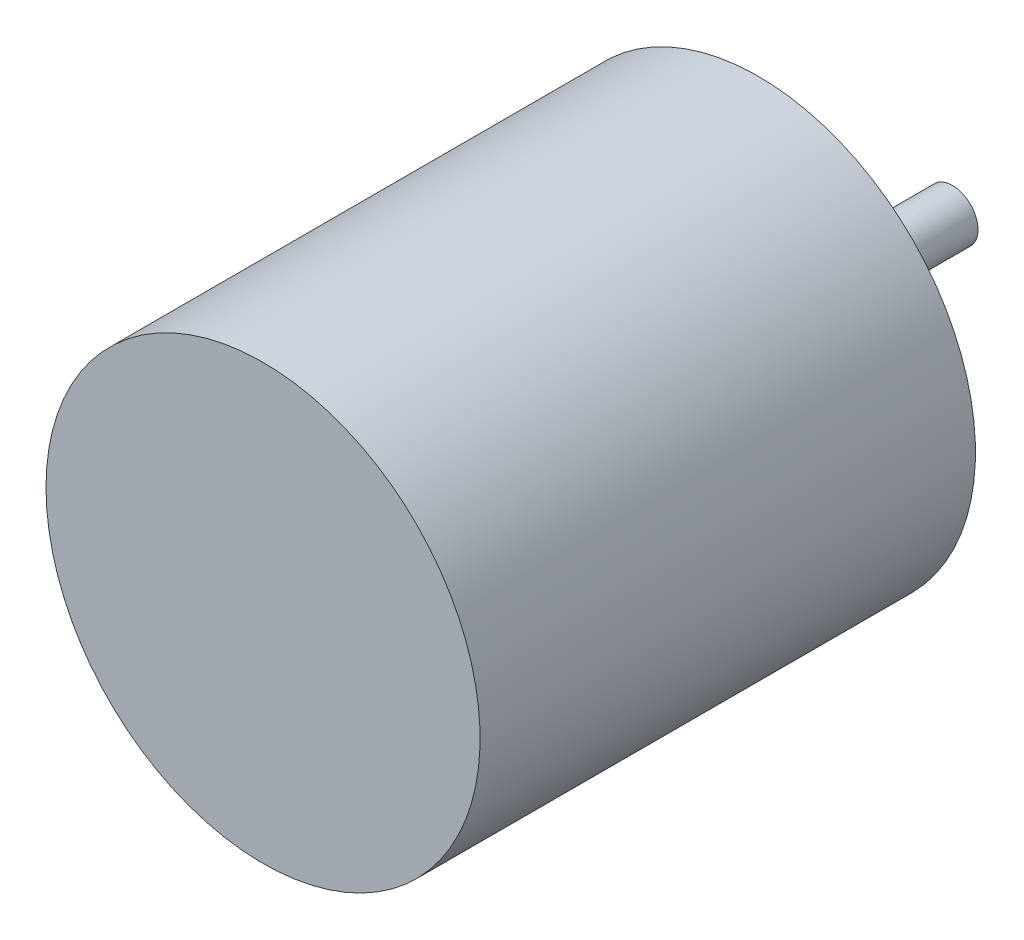
ISO-10303-21;
HEADER;
FILE_DESCRIPTION(('STEP AP214'),'2;1');
FILE_NAME('part.step','',(''),(''),'','','');
FILE_SCHEMA(('AUTOMOTIVE_DESIGN { 1 0 10303 214 1 1 1 1 }'));
ENDSEC;
DATA;
#1=APPLICATION_CONTEXT('core data for automotive mechanical design processes');
#2=APPLICATION_PROTOCOL_DEFINITION('international standard','automotive_design',2000,#1);
#3=PRODUCT_CONTEXT('',#1,'mechanical');
#4=PRODUCT('Part','Part','',(#3));
#5=PRODUCT_RELATED_PRODUCT_CATEGORY('part','',(#4));
#6=PRODUCT_DEFINITION_FORMATION('','',#4);
#7=PRODUCT_DEFINITION_CONTEXT('part definition',#1,'design');
#8=PRODUCT_DEFINITION('design','',#6,#7);
#9=PRODUCT_DEFINITION_SHAPE('','',#8);
#10=(LENGTH_UNIT() NAMED_UNIT(*) SI_UNIT(.MILLI.,.METRE.));
#11=(NAMED_UNIT(*) PLANE_ANGLE_UNIT() SI_UNIT($,.RADIAN.));
#12=(NAMED_UNIT(*) SI_UNIT($,.STERADIAN.) SOLID_ANGLE_UNIT());
#13=UNCERTAINTY_MEASURE_WITH_UNIT(LENGTH_MEASURE(1.E-05),#10,'distance_accuracy_value','');
#14=(GEOMETRIC_REPRESENTATION_CONTEXT(3) GLOBAL_UNCERTAINTY_ASSIGNED_CONTEXT((#13)) GLOBAL_UNIT_ASSIGNED_CONTEXT((#10,
#11,#12)) REPRESENTATION_CONTEXT('',''));
#15=CARTESIAN_POINT('',(0.,0.,0.));
#16=DIRECTION('',(0.,0.,1.));
#17=DIRECTION('',(1.,0.,0.));
#18=AXIS2_PLACEMENT_3D('',#15,#16,#17);
#19=CARTESIAN_POINT('',(0.,0.,24.25));
#20=DIRECTION('',(0.,0.,-1.));
#21=DIRECTION('',(-1.,0.,0.));
#22=AXIS2_PLACEMENT_3D('',#19,#20,#21);
#23=CYLINDRICAL_SURFACE('',#22,21.25);
#24=CARTESIAN_POINT('',(0.,0.,24.25));
#25=DIRECTION('',(0.,0.,1.));
#26=DIRECTION('',(1.,0.,0.));
#27=AXIS2_PLACEMENT_3D('',#24,#25,#26);
#28=CIRCLE('',#27,21.25);
#29=CARTESIAN_POINT('',(-21.25,0.,24.25));
#30=VERTEX_POINT('',#29);
#31=EDGE_CURVE('E52',#30,#30,#28,.T.);
#32=CARTESIAN_POINT('',(0.,0.,-24.25));
#33=DIRECTION('',(0.,0.,1.));
#34=DIRECTION('',(1.,0.,0.));
#35=AXIS2_PLACEMENT_3D('',#32,#33,#34);
#36=CIRCLE('',#35,21.25);
#37=CARTESIAN_POINT('',(-21.25,0.,-24.25));
#38=VERTEX_POINT('',#37);
#39=EDGE_CURVE('E60',#38,#38,#36,.T.);
#40=CARTESIAN_POINT('',(-21.25,0.,24.25));
#41=CARTESIAN_POINT('',(-21.25,0.,23.7447916666667));
#42=CARTESIAN_POINT('',(-21.25,0.,23.2395833333333));
#43=CARTESIAN_POINT('',(-21.25,0.,22.2291666666667));
#44=CARTESIAN_POINT('',(-21.25,0.,21.7239583333333));
#45=CARTESIAN_POINT('',(-21.25,0.,20.7135416666667));
#46=CARTESIAN_POINT('',(-21.25,0.,20.2083333333333));
#47=CARTESIAN_POINT('',(-21.25,0.,19.1979166666667));
#48=CARTESIAN_POINT('',(-21.25,0.,18.6927083333333));
#49=CARTESIAN_POINT('',(-21.25,0.,17.6822916666667));
#50=CARTESIAN_POINT('',(-21.25,0.,17.1770833333333));
#51=CARTESIAN_POINT('',(-21.25,0.,16.1666666666667));
#52=CARTESIAN_POINT('',(-21.25,0.,15.6614583333333));
#53=CARTESIAN_POINT('',(-21.25,0.,14.6510416666667));
#54=CARTESIAN_POINT('',(-21.25,0.,14.1458333333333));
#55=CARTESIAN_POINT('',(-21.25,0.,13.1354166666667));
#56=CARTESIAN_POINT('',(-21.25,0.,12.6302083333333));
#57=CARTESIAN_POINT('',(-21.25,0.,11.6197916666667));
#58=CARTESIAN_POINT('',(-21.25,0.,11.1145833333333));
#59=CARTESIAN_POINT('',(-21.25,0.,10.1041666666667));
#60=CARTESIAN_POINT('',(-21.25,0.,9.59895833333333));
#61=CARTESIAN_POINT('',(-21.25,0.,8.58854166666666));
#62=CARTESIAN_POINT('',(-21.25,0.,8.08333333333333));
#63=CARTESIAN_POINT('',(-21.25,0.,7.07291666666667));
#64=CARTESIAN_POINT('',(-21.25,0.,6.56770833333333));
#65=CARTESIAN_POINT('',(-21.25,0.,5.55729166666667));
#66=CARTESIAN_POINT('',(-21.25,0.,5.05208333333333));
#67=CARTESIAN_POINT('',(-21.25,0.,4.04166666666667));
#68=CARTESIAN_POINT('',(-21.25,0.,3.53645833333333));
#69=CARTESIAN_POINT('',(-21.25,0.,2.52604166666666));
#70=CARTESIAN_POINT('',(-21.25,0.,2.02083333333333));
#71=CARTESIAN_POINT('',(-21.25,0.,1.01041666666666));
#72=CARTESIAN_POINT('',(-21.25,0.,0.50520833333333));
#73=CARTESIAN_POINT('',(-21.25,0.,-0.505208333333337));
#74=CARTESIAN_POINT('',(-21.25,0.,-1.01041666666667));
#75=CARTESIAN_POINT('',(-21.25,0.,-2.02083333333334));
#76=CARTESIAN_POINT('',(-21.25,0.,-2.52604166666667));
#77=CARTESIAN_POINT('',(-21.25,0.,-3.53645833333334));
#78=CARTESIAN_POINT('',(-21.25,0.,-4.04166666666667));
#79=CARTESIAN_POINT('',(-21.25,0.,-5.05208333333334));
#80=CARTESIAN_POINT('',(-21.25,0.,-5.55729166666667));
#81=CARTESIAN_POINT('',(-21.25,0.,-6.56770833333334));
#82=CARTESIAN_POINT('',(-21.25,0.,-7.07291666666667));
#83=CARTESIAN_POINT('',(-21.25,0.,-8.08333333333334));
#84=CARTESIAN_POINT('',(-21.25,0.,-8.58854166666667));
#85=CARTESIAN_POINT('',(-21.25,0.,-9.59895833333334));
#86=CARTESIAN_POINT('',(-21.25,0.,-10.1041666666667));
#87=CARTESIAN_POINT('',(-21.25,0.,-11.1145833333333));
#88=CARTESIAN_POINT('',(-21.25,0.,-11.6197916666667));
#89=CARTESIAN_POINT('',(-21.25,0.,-12.6302083333333));
#90=CARTESIAN_POINT('',(-21.25,0.,-13.1354166666667));
#91=CARTESIAN_POINT('',(-21.25,0.,-14.1458333333333));
#92=CARTESIAN_POINT('',(-21.25,0.,-14.6510416666667));
#93=CARTESIAN_POINT('',(-21.25,0.,-15.6614583333333));
#94=CARTESIAN_POINT('',(-21.25,0.,-16.1666666666667));
#95=CARTESIAN_POINT('',(-21.25,0.,-17.1770833333333));
#96=CARTESIAN_POINT('',(-21.25,0.,-17.6822916666667));
#97=CARTESIAN_POINT('',(-21.25,0.,-18.6927083333333));
#98=CARTESIAN_POINT('',(-21.25,0.,-19.1979166666667));
#99=CARTESIAN_POINT('',(-21.25,0.,-20.2083333333333));
#100=CARTESIAN_POINT('',(-21.25,0.,-20.7135416666667));
#101=CARTESIAN_POINT('',(-21.25,0.,-21.7239583333333));
#102=CARTESIAN_POINT('',(-21.25,0.,-22.2291666666667));
#103=CARTESIAN_POINT('',(-21.25,0.,-23.2395833333333));
#104=CARTESIAN_POINT('',(-21.25,0.,-23.7447916666667));
#105=CARTESIAN_POINT('',(-21.25,0.,-24.25));
#106=B_SPLINE_CURVE_WITH_KNOTS('',3,(#40,#41,#42,#43,#44,#45,#46,#47,#48,#49,#50,#51,#52,#53,
#54,#55,#56,#57,#58,#59,#60,#61,#62,#63,#64,#65,#66,#67,#68,#69,#70,#71,#72,#73,#74,#75,#76,#77,
#78,#79,#80,#81,#82,#83,#84,#85,#86,#87,#88,#89,#90,#91,#92,#93,#94,#95,#96,#97,#98,#99,#100,
#101,#102,#103,#104,#105),.UNSPECIFIED.,.F.,.F.,(4,2,2,2,2,2,2,2,2,2,2,2,2,2,2,2,2,2,2,2,2,2,2,
2,2,2,2,2,2,2,2,2,4),(0.,1.515625,3.03125,4.546875,6.0625,7.57812500000001,9.09375,10.609375,
12.125,13.640625,15.15625,16.671875,18.1875,19.703125,21.21875,22.734375,24.25,25.765625,
27.28125,28.796875,30.3125,31.828125,33.34375,34.859375,36.375,37.890625,39.40625,40.921875,
42.4375,43.953125,45.46875,46.984375,48.5),.UNSPECIFIED.);
#107=EDGE_CURVE('BSEAM50',#30,#38,#106,.T.);
#108=ORIENTED_EDGE('',*,*,#31,.F.);
#109=ORIENTED_EDGE('',*,*,#39,.T.);
#110=ORIENTED_EDGE('',*,*,#107,.T.);
#111=ORIENTED_EDGE('',*,*,#107,.F.);
#112=EDGE_LOOP('',(#108,#110,#109,#111));
#113=FACE_BOUND('',#112,.T.);
#114=ADVANCED_FACE('F50',(#113),#23,.T.);
#115=CARTESIAN_POINT('',(0.,0.,24.25));
#116=DIRECTION('',(0.,0.,1.));
#117=DIRECTION('',(1.,0.,0.));
#118=AXIS2_PLACEMENT_3D('',#115,#116,#117);
#119=PLANE('',#118);
#120=ORIENTED_EDGE('',*,*,#31,.T.);
#121=EDGE_LOOP('',(#120));
#122=FACE_BOUND('',#121,.T.);
#123=ADVANCED_FACE('F100',(#122),#119,.T.);
#124=CARTESIAN_POINT('',(0.,0.,-24.25));
#125=DIRECTION('',(0.,0.,1.));
#126=DIRECTION('',(1.,0.,0.));
#127=AXIS2_PLACEMENT_3D('',#124,#125,#126);
#128=PLANE('',#127);
#129=CARTESIAN_POINT('',(9.0017886722874,-8.67281965104073,-24.25));
#130=DIRECTION('',(0.,0.,-1.));
#131=DIRECTION('',(-1.,0.,0.));
#132=AXIS2_PLACEMENT_3D('',#129,#130,#131);
#133=CIRCLE('',#132,1.5);
#134=CARTESIAN_POINT('',(7.5017886722874,-8.67281965104073,-24.25));
#135=VERTEX_POINT('',#134);
#136=EDGE_CURVE('E76',#135,#135,#133,.T.);
#137=ORIENTED_EDGE('',*,*,#136,.F.);
#138=EDGE_LOOP('',(#137));
#139=FACE_BOUND('',#138,.T.);
#140=CARTESIAN_POINT('',(-8.67281965104076,-9.00178867228738,-24.25));
#141=DIRECTION('',(0.,0.,-1.));
#142=DIRECTION('',(-1.,0.,0.));
#143=AXIS2_PLACEMENT_3D('',#140,#141,#142);
#144=CIRCLE('',#143,1.5);
#145=CARTESIAN_POINT('',(-10.1728196510408,-9.00178867228738,-24.25));
#146=VERTEX_POINT('',#145);
#147=EDGE_CURVE('E81',#146,#146,#144,.T.);
#148=ORIENTED_EDGE('',*,*,#147,.F.);
#149=EDGE_LOOP('',(#148));
#150=FACE_BOUND('',#149,.T.);
#151=CARTESIAN_POINT('',(-9.00178867228734,8.67281965104079,-24.25));
#152=DIRECTION('',(0.,0.,-1.));
#153=DIRECTION('',(-1.,0.,0.));
#154=AXIS2_PLACEMENT_3D('',#151,#152,#153);
#155=CIRCLE('',#154,1.5);
#156=CARTESIAN_POINT('',(-10.5017886722873,8.67281965104079,-24.25));
#157=VERTEX_POINT('',#156);
#158=EDGE_CURVE('E67',#157,#157,#155,.T.);
#159=ORIENTED_EDGE('',*,*,#158,.F.);
#160=EDGE_LOOP('',(#159));
#161=FACE_BOUND('',#160,.T.);
#162=CARTESIAN_POINT('',(8.67281965104082,9.00178867228731,-24.25));
#163=DIRECTION('',(0.,0.,-1.));
#164=DIRECTION('',(-1.,0.,0.));
#165=AXIS2_PLACEMENT_3D('',#162,#163,#164);
#166=CIRCLE('',#165,1.5);
#167=CARTESIAN_POINT('',(7.17281965104082,9.00178867228731,-24.25));
#168=VERTEX_POINT('',#167);
#169=EDGE_CURVE('E66',#168,#168,#166,.T.);
#170=ORIENTED_EDGE('',*,*,#169,.F.);
#171=EDGE_LOOP('',(#170));
#172=FACE_BOUND('',#171,.T.);
#173=CARTESIAN_POINT('',(0.,0.,-24.25));
#174=DIRECTION('',(0.,0.,1.));
#175=DIRECTION('',(1.,0.,0.));
#176=AXIS2_PLACEMENT_3D('',#173,#174,#175);
#177=CIRCLE('',#176,2.5);
#178=CARTESIAN_POINT('',(2.5,0.,-24.25));
#179=VERTEX_POINT('',#178);
#180=EDGE_CURVE('E10',#179,#179,#177,.F.);
#181=ORIENTED_EDGE('',*,*,#180,.F.);
#182=EDGE_LOOP('',(#181));
#183=FACE_BOUND('',#182,.T.);
#184=ORIENTED_EDGE('',*,*,#39,.F.);
#185=EDGE_LOOP('',(#184));
#186=FACE_BOUND('',#185,.T.);
#187=ADVANCED_FACE('F91',(#139,#150,#161,#172,#183,#186),#128,.F.);
#188=CARTESIAN_POINT('',(0.,0.,-43.25));
#189=DIRECTION('',(0.,0.,1.));
#190=DIRECTION('',(1.,0.,0.));
#191=AXIS2_PLACEMENT_3D('',#188,#189,#190);
#192=CYLINDRICAL_SURFACE('',#191,2.5);
#193=CARTESIAN_POINT('',(0.,0.,-43.25));
#194=DIRECTION('',(0.,0.,-1.));
#195=DIRECTION('',(-1.,0.,0.));
#196=AXIS2_PLACEMENT_3D('',#193,#194,#195);
#197=CIRCLE('',#196,2.5);
#198=CARTESIAN_POINT('',(-2.5,0.,-43.25));
#199=VERTEX_POINT('',#198);
#200=EDGE_CURVE('E62',#199,#199,#197,.T.);
#201=ORIENTED_EDGE('',*,*,#200,.F.);
#202=EDGE_LOOP('',(#201));
#203=FACE_BOUND('',#202,.T.);
#204=ORIENTED_EDGE('',*,*,#180,.T.);
#205=EDGE_LOOP('',(#204));
#206=FACE_BOUND('',#205,.T.);
#207=ADVANCED_FACE('F96',(#203,#206),#192,.T.);
#208=CARTESIAN_POINT('',(0.,0.,-43.25));
#209=DIRECTION('',(0.,0.,-1.));
#210=DIRECTION('',(-1.,0.,0.));
#211=AXIS2_PLACEMENT_3D('',#208,#209,#210);
#212=PLANE('',#211);
#213=ORIENTED_EDGE('',*,*,#200,.T.);
#214=EDGE_LOOP('',(#213));
#215=FACE_BOUND('',#214,.T.);
#216=ADVANCED_FACE('F113',(#215),#212,.T.);
#217=CARTESIAN_POINT('',(8.67281965104082,9.00178867228731,-22.25));
#218=DIRECTION('',(0.,0.,-1.));
#219=DIRECTION('',(-1.,0.,0.));
#220=AXIS2_PLACEMENT_3D('',#217,#218,#219);
#221=CYLINDRICAL_SURFACE('',#220,1.5);
#222=CARTESIAN_POINT('',(8.67281965104082,9.00178867228731,-22.25));
#223=DIRECTION('',(0.,0.,-1.));
#224=DIRECTION('',(-1.,0.,0.));
#225=AXIS2_PLACEMENT_3D('',#222,#223,#224);
#226=CIRCLE('',#225,1.5);
#227=CARTESIAN_POINT('',(7.17281965104082,9.00178867228731,-22.25));
#228=VERTEX_POINT('',#227);
#229=EDGE_CURVE('E69',#228,#228,#226,.T.);
#230=ORIENTED_EDGE('',*,*,#229,.F.);
#231=EDGE_LOOP('',(#230));
#232=FACE_BOUND('',#231,.T.);
#233=ORIENTED_EDGE('',*,*,#169,.T.);
#234=EDGE_LOOP('',(#233));
#235=FACE_BOUND('',#234,.T.);
#236=ADVANCED_FACE('F118',(#232,#235),#221,.F.);
#237=CARTESIAN_POINT('',(8.67281965104082,9.00178867228731,-22.25));
#238=DIRECTION('',(0.,0.,-1.));
#239=DIRECTION('',(-1.,0.,0.));
#240=AXIS2_PLACEMENT_3D('',#237,#238,#239);
#241=PLANE('',#240);
#242=ORIENTED_EDGE('',*,*,#229,.T.);
#243=EDGE_LOOP('',(#242));
#244=FACE_BOUND('',#243,.T.);
#245=ADVANCED_FACE('F125',(#244),#241,.T.);
#246=CARTESIAN_POINT('',(-9.00178867228734,8.67281965104079,-22.25));
#247=DIRECTION('',(0.,0.,-1.));
#248=DIRECTION('',(-1.,0.,0.));
#249=AXIS2_PLACEMENT_3D('',#246,#247,#248);
#250=CYLINDRICAL_SURFACE('',#249,1.5);
#251=CARTESIAN_POINT('',(-9.00178867228734,8.67281965104079,-22.25));
#252=DIRECTION('',(0.,0.,-1.));
#253=DIRECTION('',(-1.,0.,0.));
#254=AXIS2_PLACEMENT_3D('',#251,#252,#253);
#255=CIRCLE('',#254,1.5);
#256=CARTESIAN_POINT('',(-10.5017886722873,8.67281965104079,-22.25));
#257=VERTEX_POINT('',#256);
#258=EDGE_CURVE('E82',#257,#257,#255,.T.);
#259=ORIENTED_EDGE('',*,*,#258,.F.);
#260=EDGE_LOOP('',(#259));
#261=FACE_BOUND('',#260,.T.);
#262=ORIENTED_EDGE('',*,*,#158,.T.);
#263=EDGE_LOOP('',(#262));
#264=FACE_BOUND('',#263,.T.);
#265=ADVANCED_FACE('F93',(#261,#264),#250,.F.);
#266=CARTESIAN_POINT('',(-9.00178867228734,8.67281965104079,-22.25));
#267=DIRECTION('',(0.,0.,-1.));
#268=DIRECTION('',(-1.,0.,0.));
#269=AXIS2_PLACEMENT_3D('',#266,#267,#268);
#270=PLANE('',#269);
#271=ORIENTED_EDGE('',*,*,#258,.T.);
#272=EDGE_LOOP('',(#271));
#273=FACE_BOUND('',#272,.T.);
#274=ADVANCED_FACE('F141',(#273),#270,.T.);
#275=CARTESIAN_POINT('',(-8.67281965104076,-9.00178867228738,-22.25));
#276=DIRECTION('',(0.,0.,-1.));
#277=DIRECTION('',(-1.,0.,0.));
#278=AXIS2_PLACEMENT_3D('',#275,#276,#277);
#279=CYLINDRICAL_SURFACE('',#278,1.5);
#280=CARTESIAN_POINT('',(-8.67281965104076,-9.00178867228738,-22.25));
#281=DIRECTION('',(0.,0.,-1.));
#282=DIRECTION('',(-1.,0.,0.));
#283=AXIS2_PLACEMENT_3D('',#280,#281,#282);
#284=CIRCLE('',#283,1.5);
#285=CARTESIAN_POINT('',(-10.1728196510408,-9.00178867228738,-22.25));
#286=VERTEX_POINT('',#285);
#287=EDGE_CURVE('E78',#286,#286,#284,.T.);
#288=ORIENTED_EDGE('',*,*,#287,.F.);
#289=EDGE_LOOP('',(#288));
#290=FACE_BOUND('',#289,.T.);
#291=ORIENTED_EDGE('',*,*,#147,.T.);
#292=EDGE_LOOP('',(#291));
#293=FACE_BOUND('',#292,.T.);
#294=ADVANCED_FACE('F138',(#290,#293),#279,.F.);
#295=CARTESIAN_POINT('',(-8.67281965104076,-9.00178867228738,-22.25));
#296=DIRECTION('',(0.,0.,-1.));
#297=DIRECTION('',(-1.,0.,0.));
#298=AXIS2_PLACEMENT_3D('',#295,#296,#297);
#299=PLANE('',#298);
#300=ORIENTED_EDGE('',*,*,#287,.T.);
#301=EDGE_LOOP('',(#300));
#302=FACE_BOUND('',#301,.T.);
#303=ADVANCED_FACE('F135',(#302),#299,.T.);
#304=CARTESIAN_POINT('',(9.0017886722874,-8.67281965104073,-22.25));
#305=DIRECTION('',(0.,0.,-1.));
#306=DIRECTION('',(-1.,0.,0.));
#307=AXIS2_PLACEMENT_3D('',#304,#305,#306);
#308=CYLINDRICAL_SURFACE('',#307,1.5);
#309=CARTESIAN_POINT('',(9.0017886722874,-8.67281965104073,-22.25));
#310=DIRECTION('',(0.,0.,-1.));
#311=DIRECTION('',(-1.,0.,0.));
#312=AXIS2_PLACEMENT_3D('',#309,#310,#311);
#313=CIRCLE('',#312,1.5);
#314=CARTESIAN_POINT('',(7.5017886722874,-8.67281965104073,-22.25));
#315=VERTEX_POINT('',#314);
#316=EDGE_CURVE('E71',#315,#315,#313,.T.);
#317=ORIENTED_EDGE('',*,*,#316,.F.);
#318=EDGE_LOOP('',(#317));
#319=FACE_BOUND('',#318,.T.);
#320=ORIENTED_EDGE('',*,*,#136,.T.);
#321=EDGE_LOOP('',(#320));
#322=FACE_BOUND('',#321,.T.);
#323=ADVANCED_FACE('F131',(#319,#322),#308,.F.);
#324=CARTESIAN_POINT('',(9.0017886722874,-8.67281965104073,-22.25));
#325=DIRECTION('',(0.,0.,-1.));
#326=DIRECTION('',(-1.,0.,0.));
#327=AXIS2_PLACEMENT_3D('',#324,#325,#326);
#328=PLANE('',#327);
#329=ORIENTED_EDGE('',*,*,#316,.T.);
#330=EDGE_LOOP('',(#329));
#331=FACE_BOUND('',#330,.T.);
#332=ADVANCED_FACE('F126',(#331),#328,.T.);
#333=CLOSED_SHELL('',(#114,#123,#187,#207,#216,#236,#245,#265,#274,#294,#303,#323,#332));
#334=MANIFOLD_SOLID_BREP('B2',#333);
#335=ADVANCED_BREP_SHAPE_REPRESENTATION('',(#18,#334),#14);
#336=SHAPE_DEFINITION_REPRESENTATION(#9,#335);
ENDSEC;
END-ISO-10303-21;
